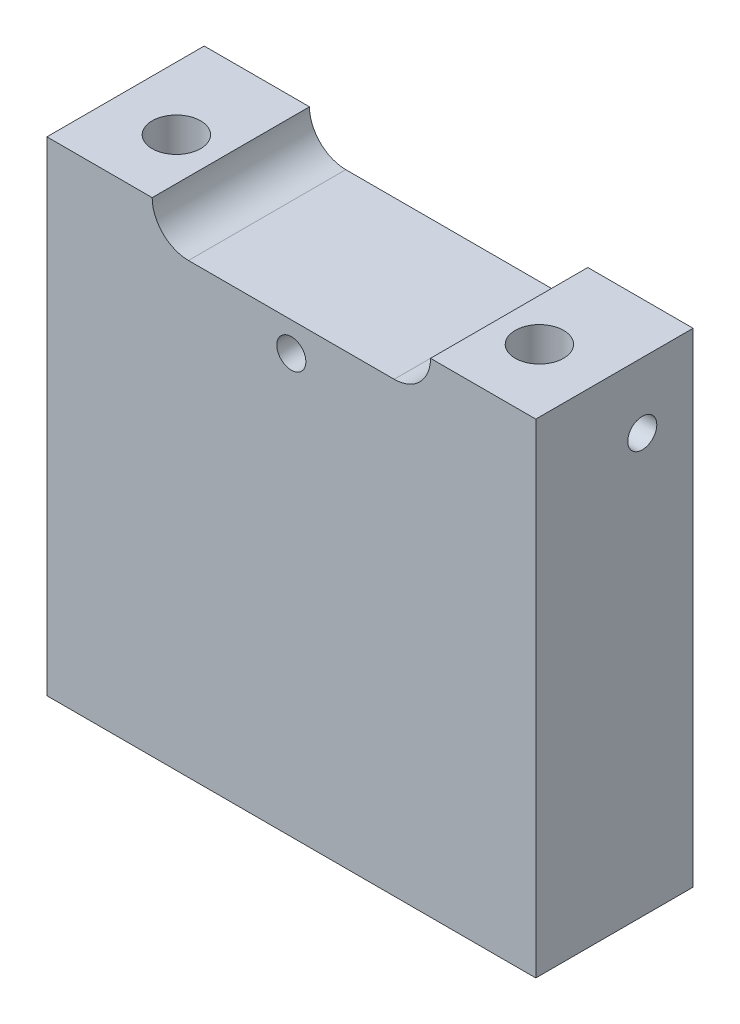
ISO-10303-21;
HEADER;
FILE_DESCRIPTION(('STEP AP214'),'2;1');
FILE_NAME('part.step','',(''),(''),'','','');
FILE_SCHEMA(('AUTOMOTIVE_DESIGN { 1 0 10303 214 1 1 1 1 }'));
ENDSEC;
DATA;
#1=APPLICATION_CONTEXT('core data for automotive mechanical design processes');
#2=APPLICATION_PROTOCOL_DEFINITION('international standard','automotive_design',2000,#1);
#3=PRODUCT_CONTEXT('',#1,'mechanical');
#4=PRODUCT('Part','Part','',(#3));
#5=PRODUCT_RELATED_PRODUCT_CATEGORY('part','',(#4));
#6=PRODUCT_DEFINITION_FORMATION('','',#4);
#7=PRODUCT_DEFINITION_CONTEXT('part definition',#1,'design');
#8=PRODUCT_DEFINITION('design','',#6,#7);
#9=PRODUCT_DEFINITION_SHAPE('','',#8);
#10=(LENGTH_UNIT() NAMED_UNIT(*) SI_UNIT(.MILLI.,.METRE.));
#11=(NAMED_UNIT(*) PLANE_ANGLE_UNIT() SI_UNIT($,.RADIAN.));
#12=(NAMED_UNIT(*) SI_UNIT($,.STERADIAN.) SOLID_ANGLE_UNIT());
#13=UNCERTAINTY_MEASURE_WITH_UNIT(LENGTH_MEASURE(1.E-05),#10,'distance_accuracy_value','');
#14=(GEOMETRIC_REPRESENTATION_CONTEXT(3) GLOBAL_UNCERTAINTY_ASSIGNED_CONTEXT((#13)) GLOBAL_UNIT_ASSIGNED_CONTEXT((#10,
#11,#12)) REPRESENTATION_CONTEXT('',''));
#15=CARTESIAN_POINT('',(0.,0.,0.));
#16=DIRECTION('',(0.,0.,1.));
#17=DIRECTION('',(1.,0.,0.));
#18=AXIS2_PLACEMENT_3D('',#15,#16,#17);
#19=CARTESIAN_POINT('',(0.,25.4,0.));
#20=DIRECTION('',(0.,1.,0.));
#21=DIRECTION('',(0.,0.,1.));
#22=AXIS2_PLACEMENT_3D('',#19,#20,#21);
#23=PLANE('',#22);
#24=DIRECTION('',(0.,0.,-1.));
#25=VECTOR('',#24,1.);
#26=CARTESIAN_POINT('',(-7.3025,25.4,21.2725));
#27=LINE('',#26,#25);
#28=CARTESIAN_POINT('',(-7.3025,25.4,4.1275));
#29=VERTEX_POINT('',#28);
#30=CARTESIAN_POINT('',(-7.3025,25.4,-4.1275));
#31=VERTEX_POINT('',#30);
#32=EDGE_CURVE('E119',#29,#31,#27,.T.);
#33=ORIENTED_EDGE('',*,*,#32,.T.);
#34=DIRECTION('',(-1.,0.,0.));
#35=VECTOR('',#34,1.);
#36=CARTESIAN_POINT('',(-12.827,25.4,-4.1275));
#37=LINE('',#36,#35);
#38=CARTESIAN_POINT('',(-12.827,25.4,-4.1275));
#39=VERTEX_POINT('',#38);
#40=EDGE_CURVE('E114',#31,#39,#37,.T.);
#41=ORIENTED_EDGE('',*,*,#40,.T.);
#42=DIRECTION('',(0.,0.,1.));
#43=VECTOR('',#42,1.);
#44=CARTESIAN_POINT('',(-12.827,25.4,4.1275));
#45=LINE('',#44,#43);
#46=CARTESIAN_POINT('',(-12.827,25.4,4.1275));
#47=VERTEX_POINT('',#46);
#48=EDGE_CURVE('E178',#39,#47,#45,.T.);
#49=ORIENTED_EDGE('',*,*,#48,.T.);
#50=DIRECTION('',(1.,0.,0.));
#51=VECTOR('',#50,1.);
#52=CARTESIAN_POINT('',(-12.827,25.4,4.1275));
#53=LINE('',#52,#51);
#54=EDGE_CURVE('E180',#47,#29,#53,.T.);
#55=ORIENTED_EDGE('',*,*,#54,.T.);
#56=EDGE_LOOP('',(#33,#41,#49,#55));
#57=FACE_BOUND('',#56,.T.);
#58=CARTESIAN_POINT('',(-9.525,25.4,0.635));
#59=DIRECTION('',(0.,1.,0.));
#60=DIRECTION('',(0.,0.,1.));
#61=AXIS2_PLACEMENT_3D('',#58,#59,#60);
#62=CIRCLE('',#61,1.27);
#63=CARTESIAN_POINT('',(-9.525,25.4,1.905));
#64=VERTEX_POINT('',#63);
#65=EDGE_CURVE('E126',#64,#64,#62,.F.);
#66=ORIENTED_EDGE('',*,*,#65,.T.);
#67=EDGE_LOOP('',(#66));
#68=FACE_BOUND('',#67,.T.);
#69=ADVANCED_FACE('F32',(#57,#68),#23,.T.);
#70=CARTESIAN_POINT('',(7.3025,25.4,4.1275));
#71=VERTEX_POINT('',#70);
#72=CARTESIAN_POINT('',(12.827,25.4,4.1275));
#73=VERTEX_POINT('',#72);
#74=EDGE_CURVE('E123',#71,#73,#53,.T.);
#75=ORIENTED_EDGE('',*,*,#74,.T.);
#76=DIRECTION('',(0.,0.,-1.));
#77=VECTOR('',#76,1.);
#78=CARTESIAN_POINT('',(12.827,25.4,4.1275));
#79=LINE('',#78,#77);
#80=CARTESIAN_POINT('',(12.827,25.4,-4.1275));
#81=VERTEX_POINT('',#80);
#82=EDGE_CURVE('E113',#73,#81,#79,.T.);
#83=ORIENTED_EDGE('',*,*,#82,.T.);
#84=CARTESIAN_POINT('',(7.3025,25.4,-4.1275));
#85=VERTEX_POINT('',#84);
#86=EDGE_CURVE('E102',#81,#85,#37,.T.);
#87=ORIENTED_EDGE('',*,*,#86,.T.);
#88=DIRECTION('',(0.,0.,-1.));
#89=VECTOR('',#88,1.);
#90=CARTESIAN_POINT('',(7.3025,25.4,21.2725));
#91=LINE('',#90,#89);
#92=EDGE_CURVE('E111',#85,#71,#91,.F.);
#93=ORIENTED_EDGE('',*,*,#92,.T.);
#94=EDGE_LOOP('',(#75,#83,#87,#93));
#95=FACE_BOUND('',#94,.T.);
#96=CARTESIAN_POINT('',(9.525,25.4,0.635));
#97=DIRECTION('',(0.,1.,0.));
#98=DIRECTION('',(0.,0.,1.));
#99=AXIS2_PLACEMENT_3D('',#96,#97,#98);
#100=CIRCLE('',#99,1.27);
#101=CARTESIAN_POINT('',(9.525,25.4,1.905));
#102=VERTEX_POINT('',#101);
#103=EDGE_CURVE('E120',#102,#102,#100,.F.);
#104=ORIENTED_EDGE('',*,*,#103,.T.);
#105=EDGE_LOOP('',(#104));
#106=FACE_BOUND('',#105,.T.);
#107=ADVANCED_FACE('F109',(#95,#106),#23,.T.);
#108=CARTESIAN_POINT('',(9.525,19.05,0.635));
#109=DIRECTION('',(0.,1.,0.));
#110=DIRECTION('',(0.,0.,1.));
#111=AXIS2_PLACEMENT_3D('',#108,#109,#110);
#112=PLANE('',#111);
#113=CARTESIAN_POINT('',(9.525,19.05,0.635));
#114=DIRECTION('',(0.,1.,0.));
#115=DIRECTION('',(0.,0.,1.));
#116=AXIS2_PLACEMENT_3D('',#113,#114,#115);
#117=CIRCLE('',#116,1.27);
#118=CARTESIAN_POINT('',(9.525,19.05,1.905));
#119=VERTEX_POINT('',#118);
#120=EDGE_CURVE('E41',#119,#119,#117,.T.);
#121=ORIENTED_EDGE('',*,*,#120,.T.);
#122=EDGE_LOOP('',(#121));
#123=FACE_BOUND('',#122,.T.);
#124=ADVANCED_FACE('F214',(#123),#112,.T.);
#125=CARTESIAN_POINT('',(9.525,19.05,0.635));
#126=DIRECTION('',(0.,1.,0.));
#127=DIRECTION('',(0.,0.,1.));
#128=AXIS2_PLACEMENT_3D('',#125,#126,#127);
#129=CYLINDRICAL_SURFACE('',#128,1.27);
#130=ORIENTED_EDGE('',*,*,#120,.F.);
#131=EDGE_LOOP('',(#130));
#132=FACE_BOUND('',#131,.T.);
#133=ORIENTED_EDGE('',*,*,#103,.F.);
#134=EDGE_LOOP('',(#133));
#135=FACE_BOUND('',#134,.T.);
#136=ADVANCED_FACE('F222',(#132,#135),#129,.F.);
#137=CARTESIAN_POINT('',(12.827,31.75,4.1275));
#138=DIRECTION('',(-1.,0.,0.));
#139=DIRECTION('',(0.,0.,1.));
#140=AXIS2_PLACEMENT_3D('',#137,#138,#139);
#141=PLANE('',#140);
#142=CARTESIAN_POINT('',(12.827,21.971,-1.4605));
#143=DIRECTION('',(1.,0.,0.));
#144=DIRECTION('',(0.,0.,-1.));
#145=AXIS2_PLACEMENT_3D('',#142,#143,#144);
#146=CIRCLE('',#145,0.762);
#147=CARTESIAN_POINT('',(12.827,21.971,-2.2225));
#148=VERTEX_POINT('',#147);
#149=EDGE_CURVE('E169',#148,#148,#146,.T.);
#150=ORIENTED_EDGE('',*,*,#149,.F.);
#151=EDGE_LOOP('',(#150));
#152=FACE_BOUND('',#151,.T.);
#153=ORIENTED_EDGE('',*,*,#82,.F.);
#154=DIRECTION('',(0.,-1.,0.));
#155=VECTOR('',#154,1.);
#156=CARTESIAN_POINT('',(12.827,31.75,4.1275));
#157=LINE('',#156,#155);
#158=CARTESIAN_POINT('',(12.827,0.,4.1275));
#159=VERTEX_POINT('',#158);
#160=EDGE_CURVE('E142',#73,#159,#157,.T.);
#161=ORIENTED_EDGE('',*,*,#160,.T.);
#162=DIRECTION('',(0.,0.,-1.));
#163=VECTOR('',#162,1.);
#164=CARTESIAN_POINT('',(12.827,0.,4.1275));
#165=LINE('',#164,#163);
#166=CARTESIAN_POINT('',(12.827,0.,-4.1275));
#167=VERTEX_POINT('',#166);
#168=EDGE_CURVE('E159',#159,#167,#165,.T.);
#169=ORIENTED_EDGE('',*,*,#168,.T.);
#170=DIRECTION('',(0.,-1.,0.));
#171=VECTOR('',#170,1.);
#172=CARTESIAN_POINT('',(12.827,31.75,-4.1275));
#173=LINE('',#172,#171);
#174=EDGE_CURVE('E136',#81,#167,#173,.T.);
#175=ORIENTED_EDGE('',*,*,#174,.F.);
#176=EDGE_LOOP('',(#153,#161,#169,#175));
#177=FACE_BOUND('',#176,.T.);
#178=ADVANCED_FACE('F225',(#152,#177),#141,.F.);
#179=CARTESIAN_POINT('',(-12.827,31.75,-4.1275));
#180=DIRECTION('',(0.,0.,1.));
#181=DIRECTION('',(1.,0.,0.));
#182=AXIS2_PLACEMENT_3D('',#179,#180,#181);
#183=PLANE('',#182);
#184=ORIENTED_EDGE('',*,*,#86,.F.);
#185=ORIENTED_EDGE('',*,*,#174,.T.);
#186=DIRECTION('',(-1.,0.,0.));
#187=VECTOR('',#186,1.);
#188=CARTESIAN_POINT('',(-12.827,0.,-4.1275));
#189=LINE('',#188,#187);
#190=CARTESIAN_POINT('',(-12.827,0.,-4.1275));
#191=VERTEX_POINT('',#190);
#192=EDGE_CURVE('E153',#167,#191,#189,.T.);
#193=ORIENTED_EDGE('',*,*,#192,.T.);
#194=DIRECTION('',(0.,-1.,0.));
#195=VECTOR('',#194,1.);
#196=CARTESIAN_POINT('',(-12.827,31.75,-4.1275));
#197=LINE('',#196,#195);
#198=EDGE_CURVE('E138',#39,#191,#197,.T.);
#199=ORIENTED_EDGE('',*,*,#198,.F.);
#200=ORIENTED_EDGE('',*,*,#40,.F.);
#201=CARTESIAN_POINT('',(-5.3975,25.4,-4.1275));
#202=DIRECTION('',(0.,0.,-1.));
#203=DIRECTION('',(-1.,0.,0.));
#204=AXIS2_PLACEMENT_3D('',#201,#202,#203);
#205=CIRCLE('',#204,1.905);
#206=CARTESIAN_POINT('',(-5.3975,23.495,-4.1275));
#207=VERTEX_POINT('',#206);
#208=EDGE_CURVE('E36',#207,#31,#205,.T.);
#209=ORIENTED_EDGE('',*,*,#208,.F.);
#210=DIRECTION('',(-1.,0.,0.));
#211=VECTOR('',#210,1.);
#212=CARTESIAN_POINT('',(-5.3975,23.495,-4.1275));
#213=LINE('',#212,#211);
#214=CARTESIAN_POINT('',(5.3975,23.495,-4.1275));
#215=VERTEX_POINT('',#214);
#216=EDGE_CURVE('E104',#215,#207,#213,.T.);
#217=ORIENTED_EDGE('',*,*,#216,.F.);
#218=CARTESIAN_POINT('',(5.3975,25.4,-4.1275));
#219=DIRECTION('',(0.,0.,-1.));
#220=DIRECTION('',(-1.,0.,0.));
#221=AXIS2_PLACEMENT_3D('',#218,#219,#220);
#222=CIRCLE('',#221,1.905);
#223=EDGE_CURVE('E49',#85,#215,#222,.T.);
#224=ORIENTED_EDGE('',*,*,#223,.F.);
#225=EDGE_LOOP('',(#184,#185,#193,#199,#200,#209,#217,#224));
#226=FACE_BOUND('',#225,.T.);
#227=ADVANCED_FACE('F101',(#226),#183,.F.);
#228=CARTESIAN_POINT('',(-12.827,31.75,4.1275));
#229=DIRECTION('',(1.,0.,0.));
#230=DIRECTION('',(0.,0.,-1.));
#231=AXIS2_PLACEMENT_3D('',#228,#229,#230);
#232=PLANE('',#231);
#233=ORIENTED_EDGE('',*,*,#48,.F.);
#234=ORIENTED_EDGE('',*,*,#198,.T.);
#235=DIRECTION('',(0.,0.,1.));
#236=VECTOR('',#235,1.);
#237=CARTESIAN_POINT('',(-12.827,0.,4.1275));
#238=LINE('',#237,#236);
#239=CARTESIAN_POINT('',(-12.827,0.,4.1275));
#240=VERTEX_POINT('',#239);
#241=EDGE_CURVE('E147',#191,#240,#238,.T.);
#242=ORIENTED_EDGE('',*,*,#241,.T.);
#243=DIRECTION('',(0.,-1.,0.));
#244=VECTOR('',#243,1.);
#245=CARTESIAN_POINT('',(-12.827,31.75,4.1275));
#246=LINE('',#245,#244);
#247=EDGE_CURVE('E140',#47,#240,#246,.T.);
#248=ORIENTED_EDGE('',*,*,#247,.F.);
#249=EDGE_LOOP('',(#233,#234,#242,#248));
#250=FACE_BOUND('',#249,.T.);
#251=ADVANCED_FACE('F189',(#250),#232,.F.);
#252=CARTESIAN_POINT('',(-12.827,31.75,4.1275));
#253=DIRECTION('',(0.,0.,-1.));
#254=DIRECTION('',(-1.,0.,0.));
#255=AXIS2_PLACEMENT_3D('',#252,#253,#254);
#256=PLANE('',#255);
#257=CARTESIAN_POINT('',(0.,21.971,4.1275));
#258=DIRECTION('',(0.,0.,1.));
#259=DIRECTION('',(1.,0.,0.));
#260=AXIS2_PLACEMENT_3D('',#257,#258,#259);
#261=CIRCLE('',#260,0.762);
#262=CARTESIAN_POINT('',(-0.761999999999999,21.971,4.1275));
#263=VERTEX_POINT('',#262);
#264=EDGE_CURVE('E165',#263,#263,#261,.T.);
#265=ORIENTED_EDGE('',*,*,#264,.F.);
#266=EDGE_LOOP('',(#265));
#267=FACE_BOUND('',#266,.T.);
#268=ORIENTED_EDGE('',*,*,#54,.F.);
#269=ORIENTED_EDGE('',*,*,#247,.T.);
#270=DIRECTION('',(1.,0.,0.));
#271=VECTOR('',#270,1.);
#272=CARTESIAN_POINT('',(-12.827,0.,4.1275));
#273=LINE('',#272,#271);
#274=EDGE_CURVE('E143',#240,#159,#273,.T.);
#275=ORIENTED_EDGE('',*,*,#274,.T.);
#276=ORIENTED_EDGE('',*,*,#160,.F.);
#277=ORIENTED_EDGE('',*,*,#74,.F.);
#278=CARTESIAN_POINT('',(5.3975,25.4,4.1275));
#279=DIRECTION('',(0.,0.,-1.));
#280=DIRECTION('',(-1.,0.,0.));
#281=AXIS2_PLACEMENT_3D('',#278,#279,#280);
#282=CIRCLE('',#281,1.905);
#283=CARTESIAN_POINT('',(5.3975,23.495,4.1275));
#284=VERTEX_POINT('',#283);
#285=EDGE_CURVE('E117',#71,#284,#282,.T.);
#286=ORIENTED_EDGE('',*,*,#285,.T.);
#287=DIRECTION('',(-1.,0.,0.));
#288=VECTOR('',#287,1.);
#289=CARTESIAN_POINT('',(-12.827,23.495,4.1275));
#290=LINE('',#289,#288);
#291=CARTESIAN_POINT('',(-5.3975,23.495,4.1275));
#292=VERTEX_POINT('',#291);
#293=EDGE_CURVE('E134',#284,#292,#290,.T.);
#294=ORIENTED_EDGE('',*,*,#293,.T.);
#295=CARTESIAN_POINT('',(-5.3975,25.4,4.1275));
#296=DIRECTION('',(0.,0.,-1.));
#297=DIRECTION('',(-1.,0.,0.));
#298=AXIS2_PLACEMENT_3D('',#295,#296,#297);
#299=CIRCLE('',#298,1.905);
#300=EDGE_CURVE('E132',#292,#29,#299,.T.);
#301=ORIENTED_EDGE('',*,*,#300,.T.);
#302=EDGE_LOOP('',(#268,#269,#275,#276,#277,#286,#294,#301));
#303=FACE_BOUND('',#302,.T.);
#304=ADVANCED_FACE('F191',(#267,#303),#256,.F.);
#305=CARTESIAN_POINT('',(-5.3975,25.4,21.2725));
#306=DIRECTION('',(0.,0.,-1.));
#307=DIRECTION('',(-1.,0.,0.));
#308=AXIS2_PLACEMENT_3D('',#305,#306,#307);
#309=CYLINDRICAL_SURFACE('',#308,1.905);
#310=ORIENTED_EDGE('',*,*,#32,.F.);
#311=ORIENTED_EDGE('',*,*,#300,.F.);
#312=DIRECTION('',(0.,0.,-1.));
#313=VECTOR('',#312,1.);
#314=CARTESIAN_POINT('',(-5.3975,23.495,21.2725));
#315=LINE('',#314,#313);
#316=EDGE_CURVE('E57',#292,#207,#315,.T.);
#317=ORIENTED_EDGE('',*,*,#316,.T.);
#318=ORIENTED_EDGE('',*,*,#208,.T.);
#319=EDGE_LOOP('',(#310,#311,#317,#318));
#320=FACE_BOUND('',#319,.T.);
#321=ADVANCED_FACE('F34',(#320),#309,.F.);
#322=CARTESIAN_POINT('',(5.3975,25.4,21.2725));
#323=DIRECTION('',(0.,0.,-1.));
#324=DIRECTION('',(-1.,0.,0.));
#325=AXIS2_PLACEMENT_3D('',#322,#323,#324);
#326=CYLINDRICAL_SURFACE('',#325,1.905);
#327=ORIENTED_EDGE('',*,*,#92,.F.);
#328=ORIENTED_EDGE('',*,*,#223,.T.);
#329=DIRECTION('',(0.,0.,-1.));
#330=VECTOR('',#329,1.);
#331=CARTESIAN_POINT('',(5.3975,23.495,21.2725));
#332=LINE('',#331,#330);
#333=EDGE_CURVE('E161',#284,#215,#332,.T.);
#334=ORIENTED_EDGE('',*,*,#333,.F.);
#335=ORIENTED_EDGE('',*,*,#285,.F.);
#336=EDGE_LOOP('',(#327,#328,#334,#335));
#337=FACE_BOUND('',#336,.T.);
#338=ADVANCED_FACE('F116',(#337),#326,.F.);
#339=CARTESIAN_POINT('',(0.,0.,0.));
#340=DIRECTION('',(0.,-1.,0.));
#341=DIRECTION('',(0.,0.,-1.));
#342=AXIS2_PLACEMENT_3D('',#339,#340,#341);
#343=PLANE('',#342);
#344=ORIENTED_EDGE('',*,*,#168,.F.);
#345=ORIENTED_EDGE('',*,*,#274,.F.);
#346=ORIENTED_EDGE('',*,*,#241,.F.);
#347=ORIENTED_EDGE('',*,*,#192,.F.);
#348=EDGE_LOOP('',(#344,#345,#346,#347));
#349=FACE_BOUND('',#348,.T.);
#350=ADVANCED_FACE('F235',(#349),#343,.T.);
#351=CARTESIAN_POINT('',(-5.3975,23.495,21.2725));
#352=DIRECTION('',(0.,-1.,0.));
#353=DIRECTION('',(1.,0.,0.));
#354=AXIS2_PLACEMENT_3D('',#351,#352,#353);
#355=PLANE('',#354);
#356=ORIENTED_EDGE('',*,*,#333,.T.);
#357=ORIENTED_EDGE('',*,*,#216,.T.);
#358=ORIENTED_EDGE('',*,*,#316,.F.);
#359=ORIENTED_EDGE('',*,*,#293,.F.);
#360=EDGE_LOOP('',(#356,#357,#358,#359));
#361=FACE_BOUND('',#360,.T.);
#362=ADVANCED_FACE('F237',(#361),#355,.F.);
#363=CARTESIAN_POINT('',(5.588,21.971,4.1275));
#364=DIRECTION('',(0.,1.,0.));
#365=DIRECTION('',(0.,0.,1.));
#366=AXIS2_PLACEMENT_3D('',#363,#364,#365);
#367=TOROIDAL_SURFACE('',#366,5.588,0.762);
#368=CARTESIAN_POINT('',(5.58800000000002,21.971,-1.4605));
#369=DIRECTION('',(-1.,0.,0.));
#370=DIRECTION('',(0.,0.,1.));
#371=AXIS2_PLACEMENT_3D('',#368,#369,#370);
#372=CIRCLE('',#371,0.762);
#373=CARTESIAN_POINT('',(5.58800000000002,21.971,-2.2225));
#374=VERTEX_POINT('',#373);
#375=EDGE_CURVE('E168',#374,#374,#372,.F.);
#376=CARTESIAN_POINT('',(5.588,21.971,4.1275));
#377=DIRECTION('',(0.,1.,0.));
#378=DIRECTION('',(0.,0.,1.));
#379=AXIS2_PLACEMENT_3D('',#376,#377,#378);
#380=CIRCLE('',#379,6.35);
#381=EDGE_CURVE('',#374,#263,#380,.T.);
#382=ORIENTED_EDGE('',*,*,#375,.T.);
#383=ORIENTED_EDGE('',*,*,#264,.T.);
#384=ORIENTED_EDGE('',*,*,#381,.T.);
#385=ORIENTED_EDGE('',*,*,#381,.F.);
#386=EDGE_LOOP('',(#382,#384,#383,#385));
#387=FACE_BOUND('',#386,.T.);
#388=ADVANCED_FACE('F215',(#387),#367,.F.);
#389=CARTESIAN_POINT('',(-12.828,21.971,-1.4605));
#390=DIRECTION('',(1.,0.,0.));
#391=DIRECTION('',(0.,0.,-1.));
#392=AXIS2_PLACEMENT_3D('',#389,#390,#391);
#393=CYLINDRICAL_SURFACE('',#392,0.762);
#394=CARTESIAN_POINT('',(5.58800000000002,21.971,-2.2225));
#395=CARTESIAN_POINT('',(5.66340625000003,21.971,-2.2225));
#396=CARTESIAN_POINT('',(5.73881250000002,21.971,-2.2225));
#397=CARTESIAN_POINT('',(5.88962500000003,21.971,-2.2225));
#398=CARTESIAN_POINT('',(5.96503125000002,21.971,-2.2225));
#399=CARTESIAN_POINT('',(6.11584375000002,21.971,-2.2225));
#400=CARTESIAN_POINT('',(6.19125000000002,21.971,-2.2225));
#401=CARTESIAN_POINT('',(6.34206250000002,21.971,-2.2225));
#402=CARTESIAN_POINT('',(6.41746875000002,21.971,-2.2225));
#403=CARTESIAN_POINT('',(6.56828125000002,21.971,-2.2225));
#404=CARTESIAN_POINT('',(6.64368750000002,21.971,-2.2225));
#405=CARTESIAN_POINT('',(6.79450000000002,21.971,-2.2225));
#406=CARTESIAN_POINT('',(6.86990625000002,21.971,-2.2225));
#407=CARTESIAN_POINT('',(7.02071875000002,21.971,-2.2225));
#408=CARTESIAN_POINT('',(7.09612500000002,21.971,-2.2225));
#409=CARTESIAN_POINT('',(7.24693750000002,21.971,-2.2225));
#410=CARTESIAN_POINT('',(7.32234375000002,21.971,-2.2225));
#411=CARTESIAN_POINT('',(7.47315625000002,21.971,-2.2225));
#412=CARTESIAN_POINT('',(7.54856250000002,21.971,-2.2225));
#413=CARTESIAN_POINT('',(7.69937500000002,21.971,-2.2225));
#414=CARTESIAN_POINT('',(7.77478125000002,21.971,-2.2225));
#415=CARTESIAN_POINT('',(7.92559375000002,21.971,-2.2225));
#416=CARTESIAN_POINT('',(8.00100000000002,21.971,-2.2225));
#417=CARTESIAN_POINT('',(8.15181250000001,21.971,-2.2225));
#418=CARTESIAN_POINT('',(8.22721875000001,21.971,-2.2225));
#419=CARTESIAN_POINT('',(8.37803125000001,21.971,-2.2225));
#420=CARTESIAN_POINT('',(8.45343750000001,21.971,-2.2225));
#421=CARTESIAN_POINT('',(8.60425000000001,21.971,-2.2225));
#422=CARTESIAN_POINT('',(8.67965625000001,21.971,-2.2225));
#423=CARTESIAN_POINT('',(8.83046875000001,21.971,-2.2225));
#424=CARTESIAN_POINT('',(8.90587500000001,21.971,-2.2225));
#425=CARTESIAN_POINT('',(9.05668750000001,21.971,-2.2225));
#426=CARTESIAN_POINT('',(9.13209375000001,21.971,-2.2225));
#427=CARTESIAN_POINT('',(9.28290625000001,21.971,-2.2225));
#428=CARTESIAN_POINT('',(9.35831250000001,21.971,-2.2225));
#429=CARTESIAN_POINT('',(9.50912500000001,21.971,-2.2225));
#430=CARTESIAN_POINT('',(9.58453125000001,21.971,-2.2225));
#431=CARTESIAN_POINT('',(9.73534375000001,21.971,-2.2225));
#432=CARTESIAN_POINT('',(9.81075000000001,21.971,-2.2225));
#433=CARTESIAN_POINT('',(9.9615625,21.971,-2.2225));
#434=CARTESIAN_POINT('',(10.03696875,21.971,-2.2225));
#435=CARTESIAN_POINT('',(10.18778125,21.971,-2.2225));
#436=CARTESIAN_POINT('',(10.2631875,21.971,-2.2225));
#437=CARTESIAN_POINT('',(10.414,21.971,-2.2225));
#438=CARTESIAN_POINT('',(10.48940625,21.971,-2.2225));
#439=CARTESIAN_POINT('',(10.64021875,21.971,-2.2225));
#440=CARTESIAN_POINT('',(10.715625,21.971,-2.2225));
#441=CARTESIAN_POINT('',(10.8664375,21.971,-2.2225));
#442=CARTESIAN_POINT('',(10.94184375,21.971,-2.2225));
#443=CARTESIAN_POINT('',(11.09265625,21.971,-2.2225));
#444=CARTESIAN_POINT('',(11.1680625,21.971,-2.2225));
#445=CARTESIAN_POINT('',(11.318875,21.971,-2.2225));
#446=CARTESIAN_POINT('',(11.39428125,21.971,-2.2225));
#447=CARTESIAN_POINT('',(11.54509375,21.971,-2.2225));
#448=CARTESIAN_POINT('',(11.6205,21.971,-2.2225));
#449=CARTESIAN_POINT('',(11.7713125,21.971,-2.2225));
#450=CARTESIAN_POINT('',(11.84671875,21.971,-2.2225));
#451=CARTESIAN_POINT('',(11.99753125,21.971,-2.2225));
#452=CARTESIAN_POINT('',(12.0729375,21.971,-2.2225));
#453=CARTESIAN_POINT('',(12.22375,21.971,-2.2225));
#454=CARTESIAN_POINT('',(12.29915625,21.971,-2.2225));
#455=CARTESIAN_POINT('',(12.44996875,21.971,-2.2225));
#456=CARTESIAN_POINT('',(12.525375,21.971,-2.2225));
#457=CARTESIAN_POINT('',(12.6761875,21.971,-2.2225));
#458=CARTESIAN_POINT('',(12.75159375,21.971,-2.2225));
#459=CARTESIAN_POINT('',(12.827,21.971,-2.2225));
#460=B_SPLINE_CURVE_WITH_KNOTS('',3,(#394,#395,#396,#397,#398,#399,#400,#401,#402,#403,#404,
#405,#406,#407,#408,#409,#410,#411,#412,#413,#414,#415,#416,#417,#418,#419,#420,#421,#422,#423,
#424,#425,#426,#427,#428,#429,#430,#431,#432,#433,#434,#435,#436,#437,#438,#439,#440,#441,#442,
#443,#444,#445,#446,#447,#448,#449,#450,#451,#452,#453,#454,#455,#456,#457,#458,#459),
.UNSPECIFIED.,.F.,.F.,(4,2,2,2,2,2,2,2,2,2,2,2,2,2,2,2,2,2,2,2,2,2,2,2,2,2,2,2,2,2,2,2,4),(0.,
0.22621875,0.4524375,0.678656249999996,0.904874999999996,1.13109375,1.35731249999999,
1.58353124999999,1.80974999999999,2.03596874999999,2.26218749999999,2.48840624999999,
2.71462499999999,2.94084374999999,3.16706249999998,3.39328124999998,3.61949999999998,
3.84571874999998,4.07193749999998,4.29815624999998,4.52437499999998,4.75059374999998,
4.97681249999998,5.20303124999998,5.42924999999998,5.65546874999998,5.88168749999998,
6.10790624999997,6.33412499999997,6.56034374999997,6.78656249999997,7.01278124999997,
7.23899999999997),.UNSPECIFIED.);
#461=EDGE_CURVE('BSEAM205',#374,#148,#460,.T.);
#462=ORIENTED_EDGE('',*,*,#375,.F.);
#463=ORIENTED_EDGE('',*,*,#149,.T.);
#464=ORIENTED_EDGE('',*,*,#461,.T.);
#465=ORIENTED_EDGE('',*,*,#461,.F.);
#466=EDGE_LOOP('',(#462,#464,#463,#465));
#467=FACE_BOUND('',#466,.T.);
#468=ADVANCED_FACE('F205',(#467),#393,.F.);
#469=CARTESIAN_POINT('',(-9.525,19.05,0.635));
#470=DIRECTION('',(0.,1.,0.));
#471=DIRECTION('',(0.,0.,1.));
#472=AXIS2_PLACEMENT_3D('',#469,#470,#471);
#473=PLANE('',#472);
#474=CARTESIAN_POINT('',(-9.525,19.05,0.635));
#475=DIRECTION('',(0.,1.,0.));
#476=DIRECTION('',(0.,0.,1.));
#477=AXIS2_PLACEMENT_3D('',#474,#475,#476);
#478=CIRCLE('',#477,1.27);
#479=CARTESIAN_POINT('',(-9.525,19.05,1.905));
#480=VERTEX_POINT('',#479);
#481=EDGE_CURVE('E11',#480,#480,#478,.T.);
#482=ORIENTED_EDGE('',*,*,#481,.T.);
#483=EDGE_LOOP('',(#482));
#484=FACE_BOUND('',#483,.T.);
#485=ADVANCED_FACE('F202',(#484),#473,.T.);
#486=CARTESIAN_POINT('',(-9.525,19.05,0.635));
#487=DIRECTION('',(0.,1.,0.));
#488=DIRECTION('',(0.,0.,1.));
#489=AXIS2_PLACEMENT_3D('',#486,#487,#488);
#490=CYLINDRICAL_SURFACE('',#489,1.27);
#491=ORIENTED_EDGE('',*,*,#481,.F.);
#492=EDGE_LOOP('',(#491));
#493=FACE_BOUND('',#492,.T.);
#494=ORIENTED_EDGE('',*,*,#65,.F.);
#495=EDGE_LOOP('',(#494));
#496=FACE_BOUND('',#495,.T.);
#497=ADVANCED_FACE('F204',(#493,#496),#490,.F.);
#498=CLOSED_SHELL('',(#69,#107,#124,#136,#178,#227,#251,#304,#321,#338,#350,#362,#388,#468,#485,#497));
#499=MANIFOLD_SOLID_BREP('B2',#498);
#500=ADVANCED_BREP_SHAPE_REPRESENTATION('',(#18,#499),#14);
#501=SHAPE_DEFINITION_REPRESENTATION(#9,#500);
ENDSEC;
END-ISO-10303-21;
